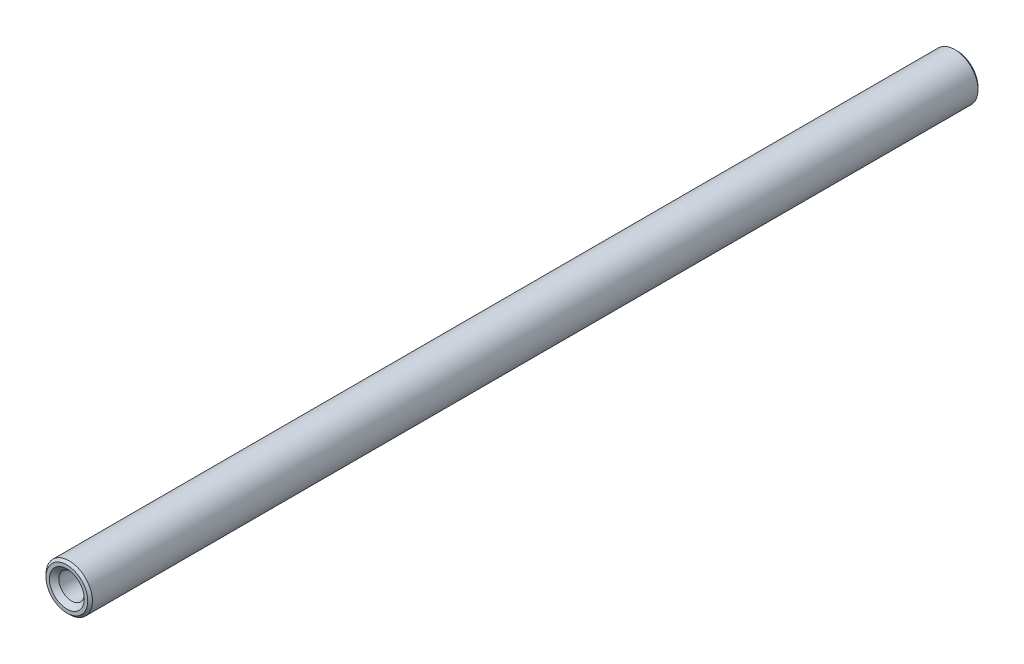
ISO-10303-21;
HEADER;
FILE_DESCRIPTION(('STEP AP214'),'2;1');
FILE_NAME('part.step','',(''),(''),'','','');
FILE_SCHEMA(('AUTOMOTIVE_DESIGN { 1 0 10303 214 1 1 1 1 }'));
ENDSEC;
DATA;
#1=APPLICATION_CONTEXT('core data for automotive mechanical design processes');
#2=APPLICATION_PROTOCOL_DEFINITION('international standard','automotive_design',2000,#1);
#3=PRODUCT_CONTEXT('',#1,'mechanical');
#4=PRODUCT('Part','Part','',(#3));
#5=PRODUCT_RELATED_PRODUCT_CATEGORY('part','',(#4));
#6=PRODUCT_DEFINITION_FORMATION('','',#4);
#7=PRODUCT_DEFINITION_CONTEXT('part definition',#1,'design');
#8=PRODUCT_DEFINITION('design','',#6,#7);
#9=PRODUCT_DEFINITION_SHAPE('','',#8);
#10=(LENGTH_UNIT() NAMED_UNIT(*) SI_UNIT(.MILLI.,.METRE.));
#11=(NAMED_UNIT(*) PLANE_ANGLE_UNIT() SI_UNIT($,.RADIAN.));
#12=(NAMED_UNIT(*) SI_UNIT($,.STERADIAN.) SOLID_ANGLE_UNIT());
#13=UNCERTAINTY_MEASURE_WITH_UNIT(LENGTH_MEASURE(1.E-05),#10,'distance_accuracy_value','');
#14=(GEOMETRIC_REPRESENTATION_CONTEXT(3) GLOBAL_UNCERTAINTY_ASSIGNED_CONTEXT((#13)) GLOBAL_UNIT_ASSIGNED_CONTEXT((#10,
#11,#12)) REPRESENTATION_CONTEXT('',''));
#15=CARTESIAN_POINT('',(0.,0.,0.));
#16=DIRECTION('',(0.,0.,1.));
#17=DIRECTION('',(1.,0.,0.));
#18=AXIS2_PLACEMENT_3D('',#15,#16,#17);
#19=CARTESIAN_POINT('',(0.,0.,115.));
#20=DIRECTION('',(0.,0.,-1.));
#21=DIRECTION('',(-1.,0.,0.));
#22=AXIS2_PLACEMENT_3D('',#19,#20,#21);
#23=CYLINDRICAL_SURFACE('',#22,3.);
#24=CARTESIAN_POINT('',(0.,0.,0.299999999999981));
#25=DIRECTION('',(0.,0.,1.));
#26=DIRECTION('',(1.,0.,0.));
#27=AXIS2_PLACEMENT_3D('',#24,#25,#26);
#28=CIRCLE('',#27,3.);
#29=CARTESIAN_POINT('',(3.,0.,0.299999999999981));
#30=VERTEX_POINT('',#29);
#31=EDGE_CURVE('E86',#30,#30,#28,.T.);
#32=ORIENTED_EDGE('',*,*,#31,.T.);
#33=EDGE_LOOP('',(#32));
#34=FACE_BOUND('',#33,.T.);
#35=CARTESIAN_POINT('',(0.,0.,114.7));
#36=DIRECTION('',(0.,0.,1.));
#37=DIRECTION('',(1.,0.,0.));
#38=AXIS2_PLACEMENT_3D('',#35,#36,#37);
#39=CIRCLE('',#38,3.);
#40=CARTESIAN_POINT('',(3.,0.,114.7));
#41=VERTEX_POINT('',#40);
#42=EDGE_CURVE('E83',#41,#41,#39,.F.);
#43=ORIENTED_EDGE('',*,*,#42,.T.);
#44=EDGE_LOOP('',(#43));
#45=FACE_BOUND('',#44,.T.);
#46=ADVANCED_FACE('F42',(#34,#45),#23,.T.);
#47=CARTESIAN_POINT('',(0.,0.,115.));
#48=DIRECTION('',(0.,0.,1.));
#49=DIRECTION('',(1.,0.,0.));
#50=AXIS2_PLACEMENT_3D('',#47,#48,#49);
#51=PLANE('',#50);
#52=CARTESIAN_POINT('',(0.,0.,115.));
#53=DIRECTION('',(0.,0.,1.));
#54=DIRECTION('',(1.,0.,0.));
#55=AXIS2_PLACEMENT_3D('',#52,#53,#54);
#56=CIRCLE('',#55,2.69999999999999);
#57=CARTESIAN_POINT('',(2.69999999999999,0.,115.));
#58=VERTEX_POINT('',#57);
#59=EDGE_CURVE('E11',#58,#58,#56,.T.);
#60=ORIENTED_EDGE('',*,*,#59,.T.);
#61=EDGE_LOOP('',(#60));
#62=FACE_BOUND('',#61,.T.);
#63=CARTESIAN_POINT('',(0.,0.,115.));
#64=DIRECTION('',(0.,0.,1.));
#65=DIRECTION('',(1.,0.,0.));
#66=AXIS2_PLACEMENT_3D('',#63,#64,#65);
#67=CIRCLE('',#66,2.25);
#68=CARTESIAN_POINT('',(2.25,0.,115.));
#69=VERTEX_POINT('',#68);
#70=EDGE_CURVE('E67',#69,#69,#67,.T.);
#71=ORIENTED_EDGE('',*,*,#70,.F.);
#72=EDGE_LOOP('',(#71));
#73=FACE_BOUND('',#72,.T.);
#74=ADVANCED_FACE('F102',(#62,#73),#51,.T.);
#75=CARTESIAN_POINT('',(0.,0.,0.));
#76=DIRECTION('',(0.,0.,1.));
#77=DIRECTION('',(1.,0.,0.));
#78=AXIS2_PLACEMENT_3D('',#75,#76,#77);
#79=PLANE('',#78);
#80=CARTESIAN_POINT('',(0.,0.,0.));
#81=DIRECTION('',(0.,0.,1.));
#82=DIRECTION('',(1.,0.,0.));
#83=AXIS2_PLACEMENT_3D('',#80,#81,#82);
#84=CIRCLE('',#83,2.70000000000001);
#85=CARTESIAN_POINT('',(2.70000000000001,0.,0.));
#86=VERTEX_POINT('',#85);
#87=EDGE_CURVE('E51',#86,#86,#84,.F.);
#88=ORIENTED_EDGE('',*,*,#87,.T.);
#89=EDGE_LOOP('',(#88));
#90=FACE_BOUND('',#89,.T.);
#91=CARTESIAN_POINT('',(0.,0.,0.));
#92=DIRECTION('',(0.,0.,-1.));
#93=DIRECTION('',(-1.,0.,0.));
#94=AXIS2_PLACEMENT_3D('',#91,#92,#93);
#95=CIRCLE('',#94,2.25);
#96=CARTESIAN_POINT('',(-2.25,0.,0.));
#97=VERTEX_POINT('',#96);
#98=EDGE_CURVE('E74',#97,#97,#95,.T.);
#99=ORIENTED_EDGE('',*,*,#98,.F.);
#100=EDGE_LOOP('',(#99));
#101=FACE_BOUND('',#100,.T.);
#102=ADVANCED_FACE('F91',(#90,#101),#79,.F.);
#103=CARTESIAN_POINT('',(0.,0.,103.));
#104=DIRECTION('',(0.,0.,1.));
#105=DIRECTION('',(1.,0.,0.));
#106=AXIS2_PLACEMENT_3D('',#103,#104,#105);
#107=CONICAL_SURFACE('',#106,1.65,1.02974425867665);
#108=CARTESIAN_POINT('',(0.,0.,102.008579978605));
#109=VERTEX_POINT('',#108);
#110=VERTEX_LOOP('',#109);
#111=FACE_BOUND('',#110,.T.);
#112=CARTESIAN_POINT('',(0.,0.,103.));
#113=DIRECTION('',(0.,0.,1.));
#114=DIRECTION('',(1.,0.,0.));
#115=AXIS2_PLACEMENT_3D('',#112,#113,#114);
#116=CIRCLE('',#115,1.65);
#117=CARTESIAN_POINT('',(1.65,0.,103.));
#118=VERTEX_POINT('',#117);
#119=EDGE_CURVE('E80',#118,#118,#116,.T.);
#120=ORIENTED_EDGE('',*,*,#119,.T.);
#121=EDGE_LOOP('',(#120));
#122=FACE_BOUND('',#121,.T.);
#123=ADVANCED_FACE('F122',(#111,#122),#107,.F.);
#124=CARTESIAN_POINT('',(0.,0.,115.));
#125=DIRECTION('',(0.,0.,1.));
#126=DIRECTION('',(1.,0.,0.));
#127=AXIS2_PLACEMENT_3D('',#124,#125,#126);
#128=CYLINDRICAL_SURFACE('',#127,1.65);
#129=ORIENTED_EDGE('',*,*,#119,.F.);
#130=EDGE_LOOP('',(#129));
#131=FACE_BOUND('',#130,.T.);
#132=CARTESIAN_POINT('',(0.,0.,114.4));
#133=DIRECTION('',(0.,0.,1.));
#134=DIRECTION('',(1.,0.,0.));
#135=AXIS2_PLACEMENT_3D('',#132,#133,#134);
#136=CIRCLE('',#135,1.65);
#137=CARTESIAN_POINT('',(1.65,0.,114.4));
#138=VERTEX_POINT('',#137);
#139=EDGE_CURVE('E71',#138,#138,#136,.T.);
#140=ORIENTED_EDGE('',*,*,#139,.T.);
#141=EDGE_LOOP('',(#140));
#142=FACE_BOUND('',#141,.T.);
#143=ADVANCED_FACE('F116',(#131,#142),#128,.F.);
#144=CARTESIAN_POINT('',(0.,0.,115.));
#145=DIRECTION('',(0.,0.,1.));
#146=DIRECTION('',(1.,0.,0.));
#147=AXIS2_PLACEMENT_3D('',#144,#145,#146);
#148=CONICAL_SURFACE('',#147,2.25,0.785398163397447);
#149=ORIENTED_EDGE('',*,*,#139,.F.);
#150=EDGE_LOOP('',(#149));
#151=FACE_BOUND('',#150,.T.);
#152=ORIENTED_EDGE('',*,*,#70,.T.);
#153=EDGE_LOOP('',(#152));
#154=FACE_BOUND('',#153,.T.);
#155=ADVANCED_FACE('F61',(#151,#154),#148,.F.);
#156=CARTESIAN_POINT('',(0.,0.,12.));
#157=DIRECTION('',(0.,0.,-1.));
#158=DIRECTION('',(-1.,0.,0.));
#159=AXIS2_PLACEMENT_3D('',#156,#157,#158);
#160=CONICAL_SURFACE('',#159,1.65,1.02974425867665);
#161=CARTESIAN_POINT('',(0.,0.,12.9914200213955));
#162=VERTEX_POINT('',#161);
#163=VERTEX_LOOP('',#162);
#164=FACE_BOUND('',#163,.T.);
#165=CARTESIAN_POINT('',(0.,0.,12.));
#166=DIRECTION('',(0.,0.,-1.));
#167=DIRECTION('',(-1.,0.,0.));
#168=AXIS2_PLACEMENT_3D('',#165,#166,#167);
#169=CIRCLE('',#168,1.65);
#170=CARTESIAN_POINT('',(-1.65,0.,12.));
#171=VERTEX_POINT('',#170);
#172=EDGE_CURVE('E65',#171,#171,#169,.T.);
#173=ORIENTED_EDGE('',*,*,#172,.T.);
#174=EDGE_LOOP('',(#173));
#175=FACE_BOUND('',#174,.T.);
#176=ADVANCED_FACE('F57',(#164,#175),#160,.F.);
#177=CARTESIAN_POINT('',(0.,0.,0.));
#178=DIRECTION('',(0.,0.,-1.));
#179=DIRECTION('',(-1.,0.,0.));
#180=AXIS2_PLACEMENT_3D('',#177,#178,#179);
#181=CYLINDRICAL_SURFACE('',#180,1.64999999999999);
#182=ORIENTED_EDGE('',*,*,#172,.F.);
#183=EDGE_LOOP('',(#182));
#184=FACE_BOUND('',#183,.T.);
#185=CARTESIAN_POINT('',(0.,0.,0.600000000000017));
#186=DIRECTION('',(0.,0.,-1.));
#187=DIRECTION('',(-1.,0.,0.));
#188=AXIS2_PLACEMENT_3D('',#185,#186,#187);
#189=CIRCLE('',#188,1.64999999999999);
#190=CARTESIAN_POINT('',(-1.64999999999999,0.,0.600000000000017));
#191=VERTEX_POINT('',#190);
#192=EDGE_CURVE('E68',#191,#191,#189,.T.);
#193=ORIENTED_EDGE('',*,*,#192,.T.);
#194=EDGE_LOOP('',(#193));
#195=FACE_BOUND('',#194,.T.);
#196=ADVANCED_FACE('F60',(#184,#195),#181,.F.);
#197=CARTESIAN_POINT('',(0.,0.,0.));
#198=DIRECTION('',(0.,0.,-1.));
#199=DIRECTION('',(-1.,0.,0.));
#200=AXIS2_PLACEMENT_3D('',#197,#198,#199);
#201=CONICAL_SURFACE('',#200,2.25,0.785398163397441);
#202=ORIENTED_EDGE('',*,*,#192,.F.);
#203=EDGE_LOOP('',(#202));
#204=FACE_BOUND('',#203,.T.);
#205=ORIENTED_EDGE('',*,*,#98,.T.);
#206=EDGE_LOOP('',(#205));
#207=FACE_BOUND('',#206,.T.);
#208=ADVANCED_FACE('F97',(#204,#207),#201,.F.);
#209=CARTESIAN_POINT('',(0.,0.,0.299999999999981));
#210=DIRECTION('',(0.,0.,1.));
#211=DIRECTION('',(1.,0.,0.));
#212=AXIS2_PLACEMENT_3D('',#209,#210,#211);
#213=CONICAL_SURFACE('',#212,3.,0.785398163397467);
#214=ORIENTED_EDGE('',*,*,#87,.F.);
#215=EDGE_LOOP('',(#214));
#216=FACE_BOUND('',#215,.T.);
#217=ORIENTED_EDGE('',*,*,#31,.F.);
#218=EDGE_LOOP('',(#217));
#219=FACE_BOUND('',#218,.T.);
#220=ADVANCED_FACE('F94',(#216,#219),#213,.T.);
#221=CARTESIAN_POINT('',(0.,0.,115.));
#222=DIRECTION('',(0.,0.,-1.));
#223=DIRECTION('',(-1.,0.,0.));
#224=AXIS2_PLACEMENT_3D('',#221,#222,#223);
#225=CONICAL_SURFACE('',#224,2.69999999999999,0.785398163397468);
#226=ORIENTED_EDGE('',*,*,#42,.F.);
#227=EDGE_LOOP('',(#226));
#228=FACE_BOUND('',#227,.T.);
#229=ORIENTED_EDGE('',*,*,#59,.F.);
#230=EDGE_LOOP('',(#229));
#231=FACE_BOUND('',#230,.T.);
#232=ADVANCED_FACE('F45',(#228,#231),#225,.T.);
#233=CLOSED_SHELL('',(#46,#74,#102,#123,#143,#155,#176,#196,#208,#220,#232));
#234=MANIFOLD_SOLID_BREP('B2',#233);
#235=ADVANCED_BREP_SHAPE_REPRESENTATION('',(#18,#234),#14);
#236=SHAPE_DEFINITION_REPRESENTATION(#9,#235);
ENDSEC;
END-ISO-10303-21;
